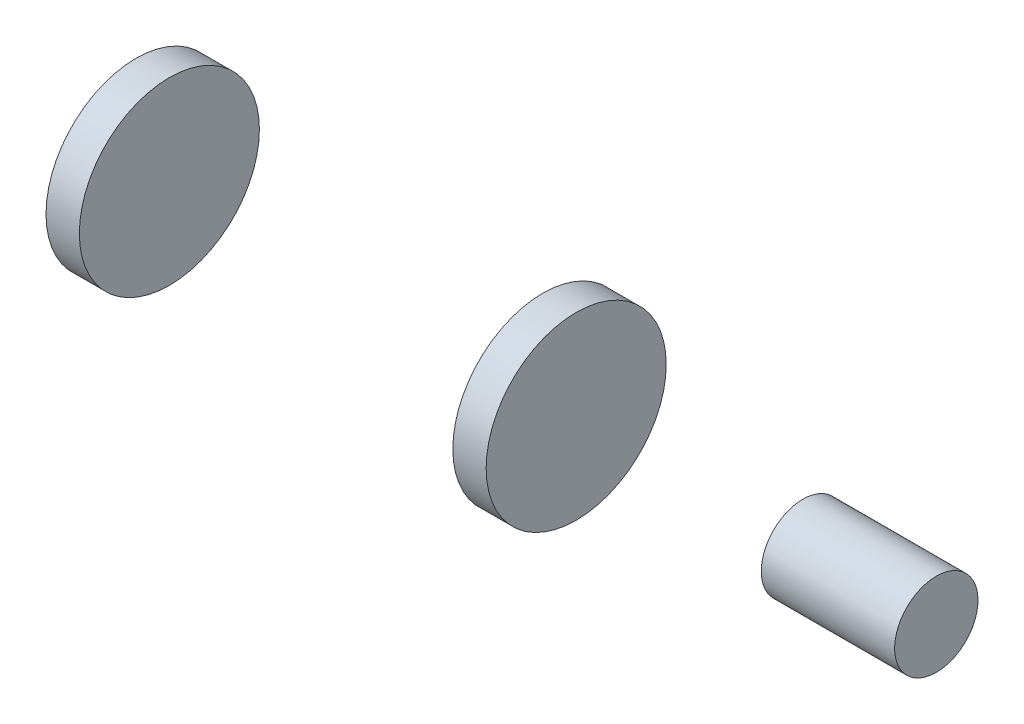
ISO-10303-21;
HEADER;
FILE_DESCRIPTION(('STEP AP214'),'2;1');
FILE_NAME('part.step','',(''),(''),'','','');
FILE_SCHEMA(('AUTOMOTIVE_DESIGN { 1 0 10303 214 1 1 1 1 }'));
ENDSEC;
DATA;
#1=APPLICATION_CONTEXT('core data for automotive mechanical design processes');
#2=APPLICATION_PROTOCOL_DEFINITION('international standard','automotive_design',2000,#1);
#3=PRODUCT_CONTEXT('',#1,'mechanical');
#4=PRODUCT('Part','Part','',(#3));
#5=PRODUCT_RELATED_PRODUCT_CATEGORY('part','',(#4));
#6=PRODUCT_DEFINITION_FORMATION('','',#4);
#7=PRODUCT_DEFINITION_CONTEXT('part definition',#1,'design');
#8=PRODUCT_DEFINITION('design','',#6,#7);
#9=PRODUCT_DEFINITION_SHAPE('','',#8);
#10=(LENGTH_UNIT() NAMED_UNIT(*) SI_UNIT(.MILLI.,.METRE.));
#11=(NAMED_UNIT(*) PLANE_ANGLE_UNIT() SI_UNIT($,.RADIAN.));
#12=(NAMED_UNIT(*) SI_UNIT($,.STERADIAN.) SOLID_ANGLE_UNIT());
#13=UNCERTAINTY_MEASURE_WITH_UNIT(LENGTH_MEASURE(1.E-05),#10,'distance_accuracy_value','');
#14=(GEOMETRIC_REPRESENTATION_CONTEXT(3) GLOBAL_UNCERTAINTY_ASSIGNED_CONTEXT((#13)) GLOBAL_UNIT_ASSIGNED_CONTEXT((#10,
#11,#12)) REPRESENTATION_CONTEXT('',''));
#15=CARTESIAN_POINT('',(0.,0.,0.));
#16=DIRECTION('',(0.,0.,1.));
#17=DIRECTION('',(1.,0.,0.));
#18=AXIS2_PLACEMENT_3D('',#15,#16,#17);
#19=CARTESIAN_POINT('',(222.,0.,0.));
#20=DIRECTION('',(1.,0.,0.));
#21=DIRECTION('',(0.,0.,-1.));
#22=AXIS2_PLACEMENT_3D('',#19,#20,#21);
#23=CYLINDRICAL_SURFACE('',#22,27.);
#24=CARTESIAN_POINT('',(222.,0.,0.));
#25=DIRECTION('',(1.,0.,0.));
#26=DIRECTION('',(0.,0.,-1.));
#27=AXIS2_PLACEMENT_3D('',#24,#25,#26);
#28=CIRCLE('',#27,27.);
#29=CARTESIAN_POINT('',(222.,0.,-27.));
#30=VERTEX_POINT('',#29);
#31=EDGE_CURVE('E11',#30,#30,#28,.T.);
#32=ORIENTED_EDGE('',*,*,#31,.T.);
#33=EDGE_LOOP('',(#32));
#34=FACE_BOUND('',#33,.T.);
#35=CARTESIAN_POINT('',(232.,0.,0.));
#36=DIRECTION('',(1.,0.,0.));
#37=DIRECTION('',(0.,0.,-1.));
#38=AXIS2_PLACEMENT_3D('',#35,#36,#37);
#39=CIRCLE('',#38,27.);
#40=CARTESIAN_POINT('',(232.,0.,-27.));
#41=VERTEX_POINT('',#40);
#42=EDGE_CURVE('E45',#41,#41,#39,.T.);
#43=ORIENTED_EDGE('',*,*,#42,.F.);
#44=EDGE_LOOP('',(#43));
#45=FACE_BOUND('',#44,.T.);
#46=ADVANCED_FACE('F42',(#34,#45),#23,.T.);
#47=CARTESIAN_POINT('',(222.,0.,0.));
#48=DIRECTION('',(1.,0.,0.));
#49=DIRECTION('',(0.,0.,-1.));
#50=AXIS2_PLACEMENT_3D('',#47,#48,#49);
#51=PLANE('',#50);
#52=ORIENTED_EDGE('',*,*,#31,.F.);
#53=EDGE_LOOP('',(#52));
#54=FACE_BOUND('',#53,.T.);
#55=ADVANCED_FACE('F57',(#54),#51,.F.);
#56=CARTESIAN_POINT('',(232.,0.,0.));
#57=DIRECTION('',(1.,0.,0.));
#58=DIRECTION('',(0.,0.,-1.));
#59=AXIS2_PLACEMENT_3D('',#56,#57,#58);
#60=PLANE('',#59);
#61=ORIENTED_EDGE('',*,*,#42,.T.);
#62=EDGE_LOOP('',(#61));
#63=FACE_BOUND('',#62,.T.);
#64=ADVANCED_FACE('F54',(#63),#60,.T.);
#65=CLOSED_SHELL('',(#46,#55,#64));
#66=MANIFOLD_SOLID_BREP('B2',#65);
#67=CARTESIAN_POINT('',(110.,0.,0.));
#68=DIRECTION('',(-1.,0.,0.));
#69=DIRECTION('',(0.,0.,1.));
#70=AXIS2_PLACEMENT_3D('',#67,#68,#69);
#71=CYLINDRICAL_SURFACE('',#70,27.);
#72=CARTESIAN_POINT('',(110.,0.,0.));
#73=DIRECTION('',(-1.,0.,0.));
#74=DIRECTION('',(0.,0.,1.));
#75=AXIS2_PLACEMENT_3D('',#72,#73,#74);
#76=CIRCLE('',#75,27.);
#77=CARTESIAN_POINT('',(110.,0.,27.));
#78=VERTEX_POINT('',#77);
#79=EDGE_CURVE('E41',#78,#78,#76,.T.);
#80=ORIENTED_EDGE('',*,*,#79,.T.);
#81=EDGE_LOOP('',(#80));
#82=FACE_BOUND('',#81,.T.);
#83=CARTESIAN_POINT('',(100.,0.,0.));
#84=DIRECTION('',(-1.,0.,0.));
#85=DIRECTION('',(0.,0.,1.));
#86=AXIS2_PLACEMENT_3D('',#83,#84,#85);
#87=CIRCLE('',#86,27.);
#88=CARTESIAN_POINT('',(100.,0.,27.));
#89=VERTEX_POINT('',#88);
#90=EDGE_CURVE('E93',#89,#89,#87,.T.);
#91=ORIENTED_EDGE('',*,*,#90,.F.);
#92=EDGE_LOOP('',(#91));
#93=FACE_BOUND('',#92,.T.);
#94=ADVANCED_FACE('F90',(#82,#93),#71,.T.);
#95=CARTESIAN_POINT('',(110.,0.,0.));
#96=DIRECTION('',(-1.,0.,0.));
#97=DIRECTION('',(0.,0.,1.));
#98=AXIS2_PLACEMENT_3D('',#95,#96,#97);
#99=PLANE('',#98);
#100=ORIENTED_EDGE('',*,*,#79,.F.);
#101=EDGE_LOOP('',(#100));
#102=FACE_BOUND('',#101,.T.);
#103=ADVANCED_FACE('F105',(#102),#99,.F.);
#104=CARTESIAN_POINT('',(100.,0.,0.));
#105=DIRECTION('',(-1.,0.,0.));
#106=DIRECTION('',(0.,0.,1.));
#107=AXIS2_PLACEMENT_3D('',#104,#105,#106);
#108=PLANE('',#107);
#109=ORIENTED_EDGE('',*,*,#90,.T.);
#110=EDGE_LOOP('',(#109));
#111=FACE_BOUND('',#110,.T.);
#112=ADVANCED_FACE('F102',(#111),#108,.T.);
#113=CLOSED_SHELL('',(#94,#103,#112));
#114=MANIFOLD_SOLID_BREP('B6',#113);
#115=CARTESIAN_POINT('',(340.,0.,0.));
#116=DIRECTION('',(-1.,0.,0.));
#117=DIRECTION('',(0.,0.,1.));
#118=AXIS2_PLACEMENT_3D('',#115,#116,#117);
#119=CYLINDRICAL_SURFACE('',#118,12.5);
#120=CARTESIAN_POINT('',(340.,0.,0.));
#121=DIRECTION('',(1.,0.,0.));
#122=DIRECTION('',(0.,0.,-1.));
#123=AXIS2_PLACEMENT_3D('',#120,#121,#122);
#124=CIRCLE('',#123,12.5);
#125=CARTESIAN_POINT('',(340.,0.,-12.5));
#126=VERTEX_POINT('',#125);
#127=EDGE_CURVE('E89',#126,#126,#124,.T.);
#128=ORIENTED_EDGE('',*,*,#127,.F.);
#129=EDGE_LOOP('',(#128));
#130=FACE_BOUND('',#129,.T.);
#131=CARTESIAN_POINT('',(300.,0.,0.));
#132=DIRECTION('',(1.,0.,0.));
#133=DIRECTION('',(0.,0.,-1.));
#134=AXIS2_PLACEMENT_3D('',#131,#132,#133);
#135=CIRCLE('',#134,12.5);
#136=CARTESIAN_POINT('',(300.,0.,-12.5));
#137=VERTEX_POINT('',#136);
#138=EDGE_CURVE('E134',#137,#137,#135,.T.);
#139=ORIENTED_EDGE('',*,*,#138,.T.);
#140=EDGE_LOOP('',(#139));
#141=FACE_BOUND('',#140,.T.);
#142=ADVANCED_FACE('F131',(#130,#141),#119,.T.);
#143=CARTESIAN_POINT('',(340.,0.,0.));
#144=DIRECTION('',(1.,0.,0.));
#145=DIRECTION('',(0.,0.,-1.));
#146=AXIS2_PLACEMENT_3D('',#143,#144,#145);
#147=PLANE('',#146);
#148=ORIENTED_EDGE('',*,*,#127,.T.);
#149=EDGE_LOOP('',(#148));
#150=FACE_BOUND('',#149,.T.);
#151=ADVANCED_FACE('F146',(#150),#147,.T.);
#152=CARTESIAN_POINT('',(300.,0.,0.));
#153=DIRECTION('',(1.,0.,0.));
#154=DIRECTION('',(0.,0.,-1.));
#155=AXIS2_PLACEMENT_3D('',#152,#153,#154);
#156=PLANE('',#155);
#157=ORIENTED_EDGE('',*,*,#138,.F.);
#158=EDGE_LOOP('',(#157));
#159=FACE_BOUND('',#158,.T.);
#160=ADVANCED_FACE('F144',(#159),#156,.F.);
#161=CLOSED_SHELL('',(#142,#151,#160));
#162=MANIFOLD_SOLID_BREP('B36',#161);
#163=ADVANCED_BREP_SHAPE_REPRESENTATION('',(#18,#66,#114,#162),#14);
#164=SHAPE_DEFINITION_REPRESENTATION(#9,#163);
ENDSEC;
END-ISO-10303-21;
